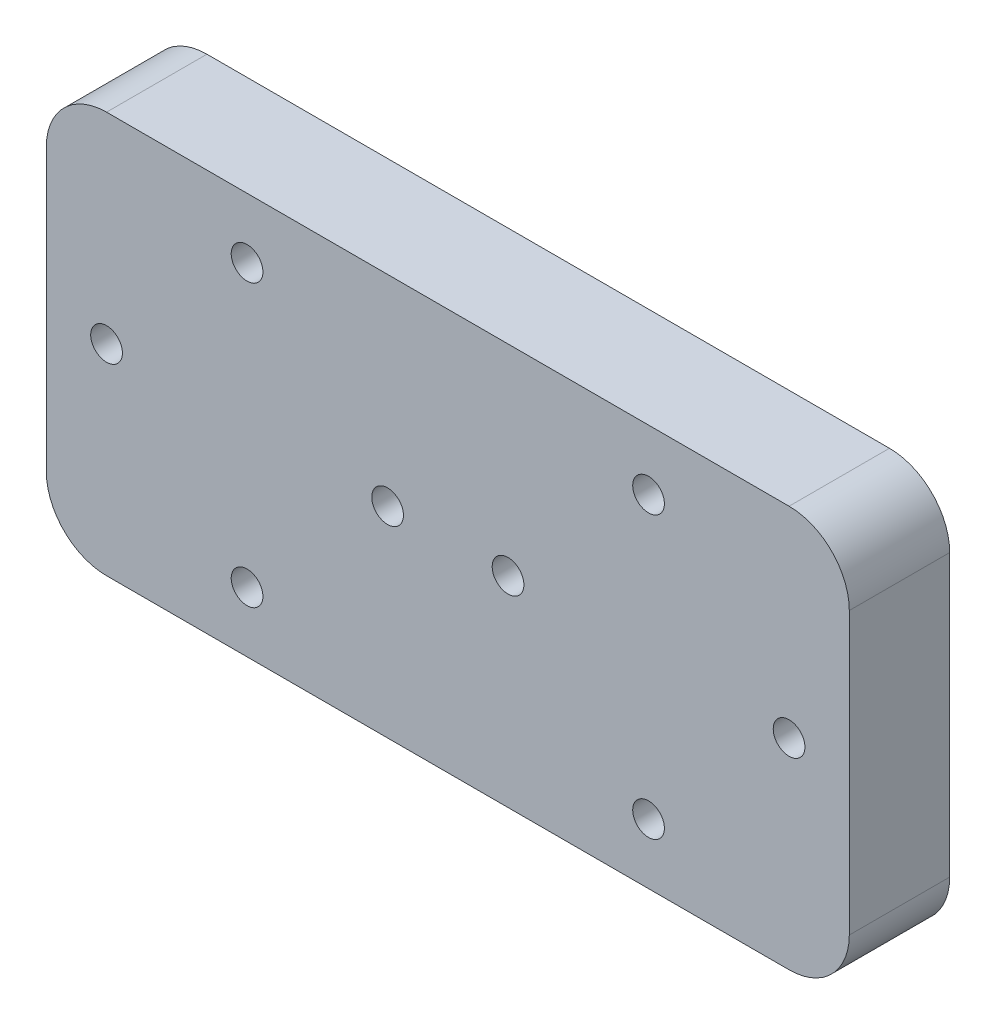
ISO-10303-21;
HEADER;
FILE_DESCRIPTION(('STEP AP214'),'2;1');
FILE_NAME('part.step','',(''),(''),'','','');
FILE_SCHEMA(('AUTOMOTIVE_DESIGN { 1 0 10303 214 1 1 1 1 }'));
ENDSEC;
DATA;
#1=APPLICATION_CONTEXT('core data for automotive mechanical design processes');
#2=APPLICATION_PROTOCOL_DEFINITION('international standard','automotive_design',2000,#1);
#3=PRODUCT_CONTEXT('',#1,'mechanical');
#4=PRODUCT('Part','Part','',(#3));
#5=PRODUCT_RELATED_PRODUCT_CATEGORY('part','',(#4));
#6=PRODUCT_DEFINITION_FORMATION('','',#4);
#7=PRODUCT_DEFINITION_CONTEXT('part definition',#1,'design');
#8=PRODUCT_DEFINITION('design','',#6,#7);
#9=PRODUCT_DEFINITION_SHAPE('','',#8);
#10=(LENGTH_UNIT() NAMED_UNIT(*) SI_UNIT(.MILLI.,.METRE.));
#11=(NAMED_UNIT(*) PLANE_ANGLE_UNIT() SI_UNIT($,.RADIAN.));
#12=(NAMED_UNIT(*) SI_UNIT($,.STERADIAN.) SOLID_ANGLE_UNIT());
#13=UNCERTAINTY_MEASURE_WITH_UNIT(LENGTH_MEASURE(1.E-05),#10,'distance_accuracy_value','');
#14=(GEOMETRIC_REPRESENTATION_CONTEXT(3) GLOBAL_UNCERTAINTY_ASSIGNED_CONTEXT((#13)) GLOBAL_UNIT_ASSIGNED_CONTEXT((#10,
#11,#12)) REPRESENTATION_CONTEXT('',''));
#15=CARTESIAN_POINT('',(0.,0.,0.));
#16=DIRECTION('',(0.,0.,1.));
#17=DIRECTION('',(1.,0.,0.));
#18=AXIS2_PLACEMENT_3D('',#15,#16,#17);
#19=CARTESIAN_POINT('',(0.,0.,5.));
#20=DIRECTION('',(1.,0.,0.));
#21=DIRECTION('',(0.,0.,-1.));
#22=AXIS2_PLACEMENT_3D('',#19,#20,#21);
#23=PLANE('',#22);
#24=DIRECTION('',(0.,-1.,0.));
#25=VECTOR('',#24,1.);
#26=CARTESIAN_POINT('',(0.,0.,0.));
#27=LINE('',#26,#25);
#28=CARTESIAN_POINT('',(0.,17.,0.));
#29=VERTEX_POINT('',#28);
#30=CARTESIAN_POINT('',(0.,3.,0.));
#31=VERTEX_POINT('',#30);
#32=EDGE_CURVE('E128',#29,#31,#27,.T.);
#33=ORIENTED_EDGE('',*,*,#32,.T.);
#34=DIRECTION('',(0.,0.,-1.));
#35=VECTOR('',#34,1.);
#36=CARTESIAN_POINT('',(0.,3.,5.));
#37=LINE('',#36,#35);
#38=CARTESIAN_POINT('',(0.,3.,5.));
#39=VERTEX_POINT('',#38);
#40=EDGE_CURVE('E105',#31,#39,#37,.F.);
#41=ORIENTED_EDGE('',*,*,#40,.T.);
#42=DIRECTION('',(0.,-1.,0.));
#43=VECTOR('',#42,1.);
#44=CARTESIAN_POINT('',(0.,0.,5.));
#45=LINE('',#44,#43);
#46=CARTESIAN_POINT('',(0.,17.,5.));
#47=VERTEX_POINT('',#46);
#48=EDGE_CURVE('E138',#47,#39,#45,.T.);
#49=ORIENTED_EDGE('',*,*,#48,.F.);
#50=DIRECTION('',(0.,0.,-1.));
#51=VECTOR('',#50,1.);
#52=CARTESIAN_POINT('',(0.,17.,5.));
#53=LINE('',#52,#51);
#54=EDGE_CURVE('E110',#47,#29,#53,.T.);
#55=ORIENTED_EDGE('',*,*,#54,.T.);
#56=EDGE_LOOP('',(#33,#41,#49,#55));
#57=FACE_BOUND('',#56,.T.);
#58=ADVANCED_FACE('F33',(#57),#23,.F.);
#59=CARTESIAN_POINT('',(0.,0.,5.));
#60=DIRECTION('',(0.,1.,0.));
#61=DIRECTION('',(0.,0.,1.));
#62=AXIS2_PLACEMENT_3D('',#59,#60,#61);
#63=PLANE('',#62);
#64=DIRECTION('',(1.,0.,0.));
#65=VECTOR('',#64,1.);
#66=CARTESIAN_POINT('',(0.,0.,5.));
#67=LINE('',#66,#65);
#68=CARTESIAN_POINT('',(3.,0.,5.));
#69=VERTEX_POINT('',#68);
#70=CARTESIAN_POINT('',(37.,0.,5.));
#71=VERTEX_POINT('',#70);
#72=EDGE_CURVE('E120',#69,#71,#67,.T.);
#73=ORIENTED_EDGE('',*,*,#72,.F.);
#74=DIRECTION('',(0.,0.,-1.));
#75=VECTOR('',#74,1.);
#76=CARTESIAN_POINT('',(3.,0.,5.));
#77=LINE('',#76,#75);
#78=CARTESIAN_POINT('',(3.,0.,0.));
#79=VERTEX_POINT('',#78);
#80=EDGE_CURVE('E104',#69,#79,#77,.T.);
#81=ORIENTED_EDGE('',*,*,#80,.T.);
#82=DIRECTION('',(1.,0.,0.));
#83=VECTOR('',#82,1.);
#84=CARTESIAN_POINT('',(0.,0.,0.));
#85=LINE('',#84,#83);
#86=CARTESIAN_POINT('',(37.,0.,0.));
#87=VERTEX_POINT('',#86);
#88=EDGE_CURVE('E117',#79,#87,#85,.T.);
#89=ORIENTED_EDGE('',*,*,#88,.T.);
#90=DIRECTION('',(0.,0.,-1.));
#91=VECTOR('',#90,1.);
#92=CARTESIAN_POINT('',(37.,0.,5.));
#93=LINE('',#92,#91);
#94=EDGE_CURVE('E122',#87,#71,#93,.F.);
#95=ORIENTED_EDGE('',*,*,#94,.T.);
#96=EDGE_LOOP('',(#73,#81,#89,#95));
#97=FACE_BOUND('',#96,.T.);
#98=ADVANCED_FACE('F116',(#97),#63,.F.);
#99=CARTESIAN_POINT('',(40.,0.,5.));
#100=DIRECTION('',(-1.,0.,0.));
#101=DIRECTION('',(0.,0.,1.));
#102=AXIS2_PLACEMENT_3D('',#99,#100,#101);
#103=PLANE('',#102);
#104=DIRECTION('',(0.,1.,0.));
#105=VECTOR('',#104,1.);
#106=CARTESIAN_POINT('',(40.,0.,5.));
#107=LINE('',#106,#105);
#108=CARTESIAN_POINT('',(40.,3.,5.));
#109=VERTEX_POINT('',#108);
#110=CARTESIAN_POINT('',(40.,17.,5.));
#111=VERTEX_POINT('',#110);
#112=EDGE_CURVE('E161',#109,#111,#107,.T.);
#113=ORIENTED_EDGE('',*,*,#112,.F.);
#114=DIRECTION('',(0.,0.,-1.));
#115=VECTOR('',#114,1.);
#116=CARTESIAN_POINT('',(40.,3.,5.));
#117=LINE('',#116,#115);
#118=CARTESIAN_POINT('',(40.,3.,0.));
#119=VERTEX_POINT('',#118);
#120=EDGE_CURVE('E11',#109,#119,#117,.T.);
#121=ORIENTED_EDGE('',*,*,#120,.T.);
#122=DIRECTION('',(0.,1.,0.));
#123=VECTOR('',#122,1.);
#124=CARTESIAN_POINT('',(40.,0.,0.));
#125=LINE('',#124,#123);
#126=CARTESIAN_POINT('',(40.,17.,0.));
#127=VERTEX_POINT('',#126);
#128=EDGE_CURVE('E127',#119,#127,#125,.T.);
#129=ORIENTED_EDGE('',*,*,#128,.T.);
#130=DIRECTION('',(0.,0.,-1.));
#131=VECTOR('',#130,1.);
#132=CARTESIAN_POINT('',(40.,17.,5.));
#133=LINE('',#132,#131);
#134=EDGE_CURVE('E41',#127,#111,#133,.F.);
#135=ORIENTED_EDGE('',*,*,#134,.T.);
#136=EDGE_LOOP('',(#113,#121,#129,#135));
#137=FACE_BOUND('',#136,.T.);
#138=ADVANCED_FACE('F160',(#137),#103,.F.);
#139=CARTESIAN_POINT('',(0.,20.,5.));
#140=DIRECTION('',(0.,-1.,0.));
#141=DIRECTION('',(0.,0.,-1.));
#142=AXIS2_PLACEMENT_3D('',#139,#140,#141);
#143=PLANE('',#142);
#144=DIRECTION('',(-1.,0.,0.));
#145=VECTOR('',#144,1.);
#146=CARTESIAN_POINT('',(0.,20.,0.));
#147=LINE('',#146,#145);
#148=CARTESIAN_POINT('',(37.,20.,0.));
#149=VERTEX_POINT('',#148);
#150=CARTESIAN_POINT('',(3.,20.,0.));
#151=VERTEX_POINT('',#150);
#152=EDGE_CURVE('E131',#149,#151,#147,.T.);
#153=ORIENTED_EDGE('',*,*,#152,.T.);
#154=DIRECTION('',(0.,0.,-1.));
#155=VECTOR('',#154,1.);
#156=CARTESIAN_POINT('',(3.,20.,5.));
#157=LINE('',#156,#155);
#158=CARTESIAN_POINT('',(3.,20.,5.));
#159=VERTEX_POINT('',#158);
#160=EDGE_CURVE('E48',#151,#159,#157,.F.);
#161=ORIENTED_EDGE('',*,*,#160,.T.);
#162=DIRECTION('',(-1.,0.,0.));
#163=VECTOR('',#162,1.);
#164=CARTESIAN_POINT('',(0.,20.,5.));
#165=LINE('',#164,#163);
#166=CARTESIAN_POINT('',(37.,20.,5.));
#167=VERTEX_POINT('',#166);
#168=EDGE_CURVE('E139',#167,#159,#165,.T.);
#169=ORIENTED_EDGE('',*,*,#168,.F.);
#170=DIRECTION('',(0.,0.,-1.));
#171=VECTOR('',#170,1.);
#172=CARTESIAN_POINT('',(37.,20.,5.));
#173=LINE('',#172,#171);
#174=EDGE_CURVE('E154',#167,#149,#173,.T.);
#175=ORIENTED_EDGE('',*,*,#174,.T.);
#176=EDGE_LOOP('',(#153,#161,#169,#175));
#177=FACE_BOUND('',#176,.T.);
#178=ADVANCED_FACE('F170',(#177),#143,.F.);
#179=CARTESIAN_POINT('',(0.,0.,5.));
#180=DIRECTION('',(0.,0.,-1.));
#181=DIRECTION('',(-1.,0.,0.));
#182=AXIS2_PLACEMENT_3D('',#179,#180,#181);
#183=PLANE('',#182);
#184=CARTESIAN_POINT('',(10.,17.,5.));
#185=DIRECTION('',(0.,0.,1.));
#186=DIRECTION('',(1.,0.,0.));
#187=AXIS2_PLACEMENT_3D('',#184,#185,#186);
#188=CIRCLE('',#187,0.790000000000001);
#189=CARTESIAN_POINT('',(10.79,17.,5.));
#190=VERTEX_POINT('',#189);
#191=EDGE_CURVE('E222',#190,#190,#188,.T.);
#192=ORIENTED_EDGE('',*,*,#191,.F.);
#193=EDGE_LOOP('',(#192));
#194=FACE_BOUND('',#193,.T.);
#195=CARTESIAN_POINT('',(10.,3.,5.));
#196=DIRECTION('',(0.,0.,1.));
#197=DIRECTION('',(1.,0.,0.));
#198=AXIS2_PLACEMENT_3D('',#195,#196,#197);
#199=CIRCLE('',#198,0.790000000000001);
#200=CARTESIAN_POINT('',(10.79,3.,5.));
#201=VERTEX_POINT('',#200);
#202=EDGE_CURVE('E216',#201,#201,#199,.T.);
#203=ORIENTED_EDGE('',*,*,#202,.F.);
#204=EDGE_LOOP('',(#203));
#205=FACE_BOUND('',#204,.T.);
#206=CARTESIAN_POINT('',(17.,10.,5.));
#207=DIRECTION('',(0.,0.,1.));
#208=DIRECTION('',(1.,0.,0.));
#209=AXIS2_PLACEMENT_3D('',#206,#207,#208);
#210=CIRCLE('',#209,0.789999999999999);
#211=CARTESIAN_POINT('',(17.79,10.,5.));
#212=VERTEX_POINT('',#211);
#213=EDGE_CURVE('E199',#212,#212,#210,.T.);
#214=ORIENTED_EDGE('',*,*,#213,.F.);
#215=EDGE_LOOP('',(#214));
#216=FACE_BOUND('',#215,.T.);
#217=CARTESIAN_POINT('',(37.,9.99999999999999,5.));
#218=DIRECTION('',(0.,0.,1.));
#219=DIRECTION('',(-1.,0.,0.));
#220=AXIS2_PLACEMENT_3D('',#217,#218,#219);
#221=CIRCLE('',#220,0.789999999999999);
#222=CARTESIAN_POINT('',(36.21,9.99999999999999,5.));
#223=VERTEX_POINT('',#222);
#224=EDGE_CURVE('E200',#223,#223,#221,.T.);
#225=ORIENTED_EDGE('',*,*,#224,.F.);
#226=EDGE_LOOP('',(#225));
#227=FACE_BOUND('',#226,.T.);
#228=CARTESIAN_POINT('',(30.,17.,5.));
#229=DIRECTION('',(0.,0.,1.));
#230=DIRECTION('',(-1.,0.,0.));
#231=AXIS2_PLACEMENT_3D('',#228,#229,#230);
#232=CIRCLE('',#231,0.789999999999999);
#233=CARTESIAN_POINT('',(29.21,17.,5.));
#234=VERTEX_POINT('',#233);
#235=EDGE_CURVE('E206',#234,#234,#232,.T.);
#236=ORIENTED_EDGE('',*,*,#235,.F.);
#237=EDGE_LOOP('',(#236));
#238=FACE_BOUND('',#237,.T.);
#239=CARTESIAN_POINT('',(30.,3.,5.));
#240=DIRECTION('',(0.,0.,1.));
#241=DIRECTION('',(-1.,0.,0.));
#242=AXIS2_PLACEMENT_3D('',#239,#240,#241);
#243=CIRCLE('',#242,0.789999999999999);
#244=CARTESIAN_POINT('',(29.21,3.,5.));
#245=VERTEX_POINT('',#244);
#246=EDGE_CURVE('E186',#245,#245,#243,.T.);
#247=ORIENTED_EDGE('',*,*,#246,.F.);
#248=EDGE_LOOP('',(#247));
#249=FACE_BOUND('',#248,.T.);
#250=CARTESIAN_POINT('',(23.,10.,5.));
#251=DIRECTION('',(0.,0.,1.));
#252=DIRECTION('',(-1.,0.,0.));
#253=AXIS2_PLACEMENT_3D('',#250,#251,#252);
#254=CIRCLE('',#253,0.789999999999999);
#255=CARTESIAN_POINT('',(22.21,10.,5.));
#256=VERTEX_POINT('',#255);
#257=EDGE_CURVE('E193',#256,#256,#254,.T.);
#258=ORIENTED_EDGE('',*,*,#257,.F.);
#259=EDGE_LOOP('',(#258));
#260=FACE_BOUND('',#259,.T.);
#261=CARTESIAN_POINT('',(3.,10.,5.));
#262=DIRECTION('',(0.,0.,1.));
#263=DIRECTION('',(1.,0.,0.));
#264=AXIS2_PLACEMENT_3D('',#261,#262,#263);
#265=CIRCLE('',#264,0.79);
#266=CARTESIAN_POINT('',(3.79,10.,5.));
#267=VERTEX_POINT('',#266);
#268=EDGE_CURVE('E180',#267,#267,#265,.T.);
#269=ORIENTED_EDGE('',*,*,#268,.F.);
#270=EDGE_LOOP('',(#269));
#271=FACE_BOUND('',#270,.T.);
#272=ORIENTED_EDGE('',*,*,#48,.T.);
#273=CARTESIAN_POINT('',(3.,3.,5.));
#274=DIRECTION('',(0.,0.,-1.));
#275=DIRECTION('',(-1.,0.,0.));
#276=AXIS2_PLACEMENT_3D('',#273,#274,#275);
#277=CIRCLE('',#276,3.);
#278=EDGE_CURVE('E152',#39,#69,#277,.F.);
#279=ORIENTED_EDGE('',*,*,#278,.T.);
#280=ORIENTED_EDGE('',*,*,#72,.T.);
#281=CARTESIAN_POINT('',(37.,3.,5.));
#282=DIRECTION('',(0.,0.,-1.));
#283=DIRECTION('',(-1.,0.,0.));
#284=AXIS2_PLACEMENT_3D('',#281,#282,#283);
#285=CIRCLE('',#284,3.);
#286=EDGE_CURVE('E148',#71,#109,#285,.F.);
#287=ORIENTED_EDGE('',*,*,#286,.T.);
#288=ORIENTED_EDGE('',*,*,#112,.T.);
#289=CARTESIAN_POINT('',(37.,17.,5.));
#290=DIRECTION('',(0.,0.,-1.));
#291=DIRECTION('',(-1.,0.,0.));
#292=AXIS2_PLACEMENT_3D('',#289,#290,#291);
#293=CIRCLE('',#292,3.);
#294=EDGE_CURVE('E55',#111,#167,#293,.F.);
#295=ORIENTED_EDGE('',*,*,#294,.T.);
#296=ORIENTED_EDGE('',*,*,#168,.T.);
#297=CARTESIAN_POINT('',(3.,17.,5.));
#298=DIRECTION('',(0.,0.,-1.));
#299=DIRECTION('',(-1.,0.,0.));
#300=AXIS2_PLACEMENT_3D('',#297,#298,#299);
#301=CIRCLE('',#300,3.);
#302=EDGE_CURVE('E150',#159,#47,#301,.F.);
#303=ORIENTED_EDGE('',*,*,#302,.T.);
#304=EDGE_LOOP('',(#272,#279,#280,#287,#288,#295,#296,#303));
#305=FACE_BOUND('',#304,.T.);
#306=ADVANCED_FACE('F165',(#194,#205,#216,#227,#238,#249,#260,#271,#305),#183,.F.);
#307=CARTESIAN_POINT('',(0.,0.,0.));
#308=DIRECTION('',(0.,0.,-1.));
#309=DIRECTION('',(-1.,0.,0.));
#310=AXIS2_PLACEMENT_3D('',#307,#308,#309);
#311=PLANE('',#310);
#312=CARTESIAN_POINT('',(10.,17.,0.));
#313=DIRECTION('',(0.,0.,1.));
#314=DIRECTION('',(1.,0.,0.));
#315=AXIS2_PLACEMENT_3D('',#312,#313,#314);
#316=CIRCLE('',#315,0.790000000000001);
#317=CARTESIAN_POINT('',(10.79,17.,0.));
#318=VERTEX_POINT('',#317);
#319=EDGE_CURVE('E183',#318,#318,#316,.T.);
#320=ORIENTED_EDGE('',*,*,#319,.T.);
#321=EDGE_LOOP('',(#320));
#322=FACE_BOUND('',#321,.T.);
#323=CARTESIAN_POINT('',(10.,3.,0.));
#324=DIRECTION('',(0.,0.,1.));
#325=DIRECTION('',(1.,0.,0.));
#326=AXIS2_PLACEMENT_3D('',#323,#324,#325);
#327=CIRCLE('',#326,0.790000000000001);
#328=CARTESIAN_POINT('',(10.79,3.,0.));
#329=VERTEX_POINT('',#328);
#330=EDGE_CURVE('E219',#329,#329,#327,.T.);
#331=ORIENTED_EDGE('',*,*,#330,.T.);
#332=EDGE_LOOP('',(#331));
#333=FACE_BOUND('',#332,.T.);
#334=CARTESIAN_POINT('',(17.,10.,0.));
#335=DIRECTION('',(0.,0.,1.));
#336=DIRECTION('',(1.,0.,0.));
#337=AXIS2_PLACEMENT_3D('',#334,#335,#336);
#338=CIRCLE('',#337,0.789999999999999);
#339=CARTESIAN_POINT('',(17.79,10.,0.));
#340=VERTEX_POINT('',#339);
#341=EDGE_CURVE('E213',#340,#340,#338,.T.);
#342=ORIENTED_EDGE('',*,*,#341,.T.);
#343=EDGE_LOOP('',(#342));
#344=FACE_BOUND('',#343,.T.);
#345=CARTESIAN_POINT('',(37.,9.99999999999999,0.));
#346=DIRECTION('',(0.,0.,1.));
#347=DIRECTION('',(-1.,0.,0.));
#348=AXIS2_PLACEMENT_3D('',#345,#346,#347);
#349=CIRCLE('',#348,0.789999999999999);
#350=CARTESIAN_POINT('',(36.21,9.99999999999999,0.));
#351=VERTEX_POINT('',#350);
#352=EDGE_CURVE('E203',#351,#351,#349,.T.);
#353=ORIENTED_EDGE('',*,*,#352,.T.);
#354=EDGE_LOOP('',(#353));
#355=FACE_BOUND('',#354,.T.);
#356=CARTESIAN_POINT('',(30.,17.,0.));
#357=DIRECTION('',(0.,0.,1.));
#358=DIRECTION('',(-1.,0.,0.));
#359=AXIS2_PLACEMENT_3D('',#356,#357,#358);
#360=CIRCLE('',#359,0.789999999999999);
#361=CARTESIAN_POINT('',(29.21,17.,0.));
#362=VERTEX_POINT('',#361);
#363=EDGE_CURVE('E190',#362,#362,#360,.T.);
#364=ORIENTED_EDGE('',*,*,#363,.T.);
#365=EDGE_LOOP('',(#364));
#366=FACE_BOUND('',#365,.T.);
#367=CARTESIAN_POINT('',(30.,3.,0.));
#368=DIRECTION('',(0.,0.,1.));
#369=DIRECTION('',(-1.,0.,0.));
#370=AXIS2_PLACEMENT_3D('',#367,#368,#369);
#371=CIRCLE('',#370,0.789999999999999);
#372=CARTESIAN_POINT('',(29.21,3.,0.));
#373=VERTEX_POINT('',#372);
#374=EDGE_CURVE('E189',#373,#373,#371,.T.);
#375=ORIENTED_EDGE('',*,*,#374,.T.);
#376=EDGE_LOOP('',(#375));
#377=FACE_BOUND('',#376,.T.);
#378=CARTESIAN_POINT('',(23.,10.,0.));
#379=DIRECTION('',(0.,0.,1.));
#380=DIRECTION('',(-1.,0.,0.));
#381=AXIS2_PLACEMENT_3D('',#378,#379,#380);
#382=CIRCLE('',#381,0.789999999999999);
#383=CARTESIAN_POINT('',(22.21,10.,0.));
#384=VERTEX_POINT('',#383);
#385=EDGE_CURVE('E196',#384,#384,#382,.T.);
#386=ORIENTED_EDGE('',*,*,#385,.T.);
#387=EDGE_LOOP('',(#386));
#388=FACE_BOUND('',#387,.T.);
#389=CARTESIAN_POINT('',(3.,10.,0.));
#390=DIRECTION('',(0.,0.,1.));
#391=DIRECTION('',(1.,0.,0.));
#392=AXIS2_PLACEMENT_3D('',#389,#390,#391);
#393=CIRCLE('',#392,0.79);
#394=CARTESIAN_POINT('',(3.79,10.,0.));
#395=VERTEX_POINT('',#394);
#396=EDGE_CURVE('E133',#395,#395,#393,.T.);
#397=ORIENTED_EDGE('',*,*,#396,.T.);
#398=EDGE_LOOP('',(#397));
#399=FACE_BOUND('',#398,.T.);
#400=ORIENTED_EDGE('',*,*,#88,.F.);
#401=CARTESIAN_POINT('',(3.,3.,0.));
#402=DIRECTION('',(0.,0.,-1.));
#403=DIRECTION('',(-1.,0.,0.));
#404=AXIS2_PLACEMENT_3D('',#401,#402,#403);
#405=CIRCLE('',#404,3.);
#406=EDGE_CURVE('E100',#79,#31,#405,.T.);
#407=ORIENTED_EDGE('',*,*,#406,.T.);
#408=ORIENTED_EDGE('',*,*,#32,.F.);
#409=CARTESIAN_POINT('',(3.,17.,0.));
#410=DIRECTION('',(0.,0.,-1.));
#411=DIRECTION('',(-1.,0.,0.));
#412=AXIS2_PLACEMENT_3D('',#409,#410,#411);
#413=CIRCLE('',#412,3.);
#414=EDGE_CURVE('E111',#29,#151,#413,.T.);
#415=ORIENTED_EDGE('',*,*,#414,.T.);
#416=ORIENTED_EDGE('',*,*,#152,.F.);
#417=CARTESIAN_POINT('',(37.,17.,0.));
#418=DIRECTION('',(0.,0.,-1.));
#419=DIRECTION('',(-1.,0.,0.));
#420=AXIS2_PLACEMENT_3D('',#417,#418,#419);
#421=CIRCLE('',#420,3.);
#422=EDGE_CURVE('E121',#149,#127,#421,.T.);
#423=ORIENTED_EDGE('',*,*,#422,.T.);
#424=ORIENTED_EDGE('',*,*,#128,.F.);
#425=CARTESIAN_POINT('',(37.,3.,0.));
#426=DIRECTION('',(0.,0.,-1.));
#427=DIRECTION('',(-1.,0.,0.));
#428=AXIS2_PLACEMENT_3D('',#425,#426,#427);
#429=CIRCLE('',#428,3.);
#430=EDGE_CURVE('E126',#119,#87,#429,.T.);
#431=ORIENTED_EDGE('',*,*,#430,.T.);
#432=EDGE_LOOP('',(#400,#407,#408,#415,#416,#423,#424,#431));
#433=FACE_BOUND('',#432,.T.);
#434=ADVANCED_FACE('F124',(#322,#333,#344,#355,#366,#377,#388,#399,#433),#311,.T.);
#435=CARTESIAN_POINT('',(3.,3.,5.));
#436=DIRECTION('',(0.,0.,-1.));
#437=DIRECTION('',(-1.,0.,0.));
#438=AXIS2_PLACEMENT_3D('',#435,#436,#437);
#439=CYLINDRICAL_SURFACE('',#438,3.);
#440=ORIENTED_EDGE('',*,*,#278,.F.);
#441=ORIENTED_EDGE('',*,*,#40,.F.);
#442=ORIENTED_EDGE('',*,*,#406,.F.);
#443=ORIENTED_EDGE('',*,*,#80,.F.);
#444=EDGE_LOOP('',(#440,#441,#442,#443));
#445=FACE_BOUND('',#444,.T.);
#446=ADVANCED_FACE('F103',(#445),#439,.T.);
#447=CARTESIAN_POINT('',(3.,17.,5.));
#448=DIRECTION('',(0.,0.,-1.));
#449=DIRECTION('',(-1.,0.,0.));
#450=AXIS2_PLACEMENT_3D('',#447,#448,#449);
#451=CYLINDRICAL_SURFACE('',#450,3.);
#452=ORIENTED_EDGE('',*,*,#302,.F.);
#453=ORIENTED_EDGE('',*,*,#160,.F.);
#454=ORIENTED_EDGE('',*,*,#414,.F.);
#455=ORIENTED_EDGE('',*,*,#54,.F.);
#456=EDGE_LOOP('',(#452,#453,#454,#455));
#457=FACE_BOUND('',#456,.T.);
#458=ADVANCED_FACE('F174',(#457),#451,.T.);
#459=CARTESIAN_POINT('',(37.,3.,5.));
#460=DIRECTION('',(0.,0.,-1.));
#461=DIRECTION('',(-1.,0.,0.));
#462=AXIS2_PLACEMENT_3D('',#459,#460,#461);
#463=CYLINDRICAL_SURFACE('',#462,3.);
#464=ORIENTED_EDGE('',*,*,#286,.F.);
#465=ORIENTED_EDGE('',*,*,#94,.F.);
#466=ORIENTED_EDGE('',*,*,#430,.F.);
#467=ORIENTED_EDGE('',*,*,#120,.F.);
#468=EDGE_LOOP('',(#464,#465,#466,#467));
#469=FACE_BOUND('',#468,.T.);
#470=ADVANCED_FACE('F266',(#469),#463,.T.);
#471=CARTESIAN_POINT('',(37.,17.,5.));
#472=DIRECTION('',(0.,0.,-1.));
#473=DIRECTION('',(-1.,0.,0.));
#474=AXIS2_PLACEMENT_3D('',#471,#472,#473);
#475=CYLINDRICAL_SURFACE('',#474,3.);
#476=ORIENTED_EDGE('',*,*,#294,.F.);
#477=ORIENTED_EDGE('',*,*,#134,.F.);
#478=ORIENTED_EDGE('',*,*,#422,.F.);
#479=ORIENTED_EDGE('',*,*,#174,.F.);
#480=EDGE_LOOP('',(#476,#477,#478,#479));
#481=FACE_BOUND('',#480,.T.);
#482=ADVANCED_FACE('F35',(#481),#475,.T.);
#483=CARTESIAN_POINT('',(3.,10.,0.));
#484=DIRECTION('',(0.,0.,1.));
#485=DIRECTION('',(1.,0.,0.));
#486=AXIS2_PLACEMENT_3D('',#483,#484,#485);
#487=CYLINDRICAL_SURFACE('',#486,0.79);
#488=ORIENTED_EDGE('',*,*,#396,.F.);
#489=EDGE_LOOP('',(#488));
#490=FACE_BOUND('',#489,.T.);
#491=ORIENTED_EDGE('',*,*,#268,.T.);
#492=EDGE_LOOP('',(#491));
#493=FACE_BOUND('',#492,.T.);
#494=ADVANCED_FACE('F254',(#490,#493),#487,.F.);
#495=CARTESIAN_POINT('',(23.,10.,0.));
#496=DIRECTION('',(0.,0.,1.));
#497=DIRECTION('',(1.,0.,0.));
#498=AXIS2_PLACEMENT_3D('',#495,#496,#497);
#499=CYLINDRICAL_SURFACE('',#498,0.789999999999999);
#500=ORIENTED_EDGE('',*,*,#385,.F.);
#501=EDGE_LOOP('',(#500));
#502=FACE_BOUND('',#501,.T.);
#503=ORIENTED_EDGE('',*,*,#257,.T.);
#504=EDGE_LOOP('',(#503));
#505=FACE_BOUND('',#504,.T.);
#506=ADVANCED_FACE('F256',(#502,#505),#499,.F.);
#507=CARTESIAN_POINT('',(30.,3.,0.));
#508=DIRECTION('',(0.,0.,1.));
#509=DIRECTION('',(1.,0.,0.));
#510=AXIS2_PLACEMENT_3D('',#507,#508,#509);
#511=CYLINDRICAL_SURFACE('',#510,0.789999999999999);
#512=ORIENTED_EDGE('',*,*,#374,.F.);
#513=EDGE_LOOP('',(#512));
#514=FACE_BOUND('',#513,.T.);
#515=ORIENTED_EDGE('',*,*,#246,.T.);
#516=EDGE_LOOP('',(#515));
#517=FACE_BOUND('',#516,.T.);
#518=ADVANCED_FACE('F263',(#514,#517),#511,.F.);
#519=CARTESIAN_POINT('',(30.,17.,0.));
#520=DIRECTION('',(0.,0.,1.));
#521=DIRECTION('',(1.,0.,0.));
#522=AXIS2_PLACEMENT_3D('',#519,#520,#521);
#523=CYLINDRICAL_SURFACE('',#522,0.789999999999999);
#524=ORIENTED_EDGE('',*,*,#363,.F.);
#525=EDGE_LOOP('',(#524));
#526=FACE_BOUND('',#525,.T.);
#527=ORIENTED_EDGE('',*,*,#235,.T.);
#528=EDGE_LOOP('',(#527));
#529=FACE_BOUND('',#528,.T.);
#530=ADVANCED_FACE('F320',(#526,#529),#523,.F.);
#531=CARTESIAN_POINT('',(37.,9.99999999999999,0.));
#532=DIRECTION('',(0.,0.,1.));
#533=DIRECTION('',(1.,0.,0.));
#534=AXIS2_PLACEMENT_3D('',#531,#532,#533);
#535=CYLINDRICAL_SURFACE('',#534,0.789999999999999);
#536=ORIENTED_EDGE('',*,*,#352,.F.);
#537=EDGE_LOOP('',(#536));
#538=FACE_BOUND('',#537,.T.);
#539=ORIENTED_EDGE('',*,*,#224,.T.);
#540=EDGE_LOOP('',(#539));
#541=FACE_BOUND('',#540,.T.);
#542=ADVANCED_FACE('F329',(#538,#541),#535,.F.);
#543=CARTESIAN_POINT('',(17.,10.,0.));
#544=DIRECTION('',(0.,0.,1.));
#545=DIRECTION('',(1.,0.,0.));
#546=AXIS2_PLACEMENT_3D('',#543,#544,#545);
#547=CYLINDRICAL_SURFACE('',#546,0.789999999999999);
#548=ORIENTED_EDGE('',*,*,#341,.F.);
#549=EDGE_LOOP('',(#548));
#550=FACE_BOUND('',#549,.T.);
#551=ORIENTED_EDGE('',*,*,#213,.T.);
#552=EDGE_LOOP('',(#551));
#553=FACE_BOUND('',#552,.T.);
#554=ADVANCED_FACE('F339',(#550,#553),#547,.F.);
#555=CARTESIAN_POINT('',(10.,3.,0.));
#556=DIRECTION('',(0.,0.,1.));
#557=DIRECTION('',(1.,0.,0.));
#558=AXIS2_PLACEMENT_3D('',#555,#556,#557);
#559=CYLINDRICAL_SURFACE('',#558,0.790000000000001);
#560=ORIENTED_EDGE('',*,*,#330,.F.);
#561=EDGE_LOOP('',(#560));
#562=FACE_BOUND('',#561,.T.);
#563=ORIENTED_EDGE('',*,*,#202,.T.);
#564=EDGE_LOOP('',(#563));
#565=FACE_BOUND('',#564,.T.);
#566=ADVANCED_FACE('F233',(#562,#565),#559,.F.);
#567=CARTESIAN_POINT('',(10.,17.,0.));
#568=DIRECTION('',(0.,0.,1.));
#569=DIRECTION('',(1.,0.,0.));
#570=AXIS2_PLACEMENT_3D('',#567,#568,#569);
#571=CYLINDRICAL_SURFACE('',#570,0.790000000000001);
#572=ORIENTED_EDGE('',*,*,#319,.F.);
#573=EDGE_LOOP('',(#572));
#574=FACE_BOUND('',#573,.T.);
#575=ORIENTED_EDGE('',*,*,#191,.T.);
#576=EDGE_LOOP('',(#575));
#577=FACE_BOUND('',#576,.T.);
#578=ADVANCED_FACE('F230',(#574,#577),#571,.F.);
#579=CLOSED_SHELL('',(#58,#98,#138,#178,#306,#434,#446,#458,#470,#482,#494,#506,#518,#530,#542,
#554,#566,#578));
#580=MANIFOLD_SOLID_BREP('B2',#579);
#581=ADVANCED_BREP_SHAPE_REPRESENTATION('',(#18,#580),#14);
#582=SHAPE_DEFINITION_REPRESENTATION(#9,#581);
ENDSEC;
END-ISO-10303-21;
